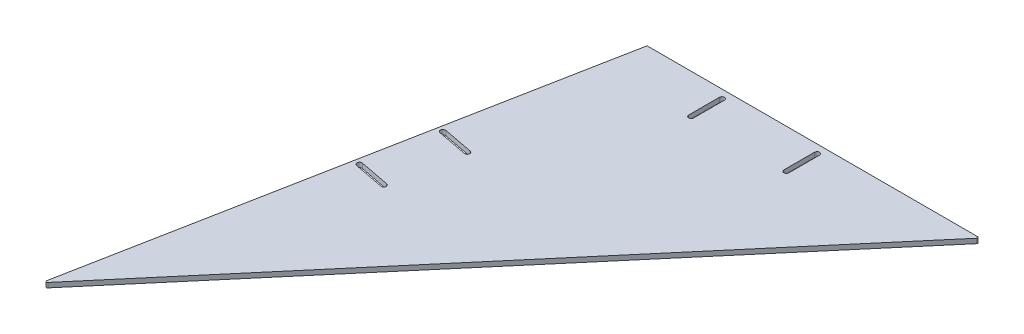
ISO-10303-21;
HEADER;
FILE_DESCRIPTION(('STEP AP214'),'2;1');
FILE_NAME('part.step','',(''),(''),'','','');
FILE_SCHEMA(('AUTOMOTIVE_DESIGN { 1 0 10303 214 1 1 1 1 }'));
ENDSEC;
DATA;
#1=APPLICATION_CONTEXT('core data for automotive mechanical design processes');
#2=APPLICATION_PROTOCOL_DEFINITION('international standard','automotive_design',2000,#1);
#3=PRODUCT_CONTEXT('',#1,'mechanical');
#4=PRODUCT('Part','Part','',(#3));
#5=PRODUCT_RELATED_PRODUCT_CATEGORY('part','',(#4));
#6=PRODUCT_DEFINITION_FORMATION('','',#4);
#7=PRODUCT_DEFINITION_CONTEXT('part definition',#1,'design');
#8=PRODUCT_DEFINITION('design','',#6,#7);
#9=PRODUCT_DEFINITION_SHAPE('','',#8);
#10=(LENGTH_UNIT() NAMED_UNIT(*) SI_UNIT(.MILLI.,.METRE.));
#11=(NAMED_UNIT(*) PLANE_ANGLE_UNIT() SI_UNIT($,.RADIAN.));
#12=(NAMED_UNIT(*) SI_UNIT($,.STERADIAN.) SOLID_ANGLE_UNIT());
#13=UNCERTAINTY_MEASURE_WITH_UNIT(LENGTH_MEASURE(1.E-05),#10,'distance_accuracy_value','');
#14=(GEOMETRIC_REPRESENTATION_CONTEXT(3) GLOBAL_UNCERTAINTY_ASSIGNED_CONTEXT((#13)) GLOBAL_UNIT_ASSIGNED_CONTEXT((#10,
#11,#12)) REPRESENTATION_CONTEXT('',''));
#15=CARTESIAN_POINT('',(0.,0.,0.));
#16=DIRECTION('',(0.,0.,1.));
#17=DIRECTION('',(1.,0.,0.));
#18=AXIS2_PLACEMENT_3D('',#15,#16,#17);
#19=CARTESIAN_POINT('',(0.,4.,0.));
#20=DIRECTION('',(0.,1.,0.));
#21=DIRECTION('',(0.,0.,1.));
#22=AXIS2_PLACEMENT_3D('',#19,#20,#21);
#23=PLANE('',#22);
#24=DIRECTION('',(-0.188731527093596,0.,0.982028721922592));
#25=VECTOR('',#24,1.);
#26=CARTESIAN_POINT('',(-280.,4.,0.));
#27=LINE('',#26,#25);
#28=CARTESIAN_POINT('',(-280.155913910007,4.,0.811268472906411));
#29=VERTEX_POINT('',#28);
#30=CARTESIAN_POINT('',(-361.378998507293,4.,423.440191080663));
#31=VERTEX_POINT('',#30);
#32=EDGE_CURVE('E329',#29,#31,#27,.T.);
#33=ORIENTED_EDGE('',*,*,#32,.T.);
#34=CARTESIAN_POINT('',(-360.396969785371,4.,423.628922607756));
#35=DIRECTION('',(0.,1.,0.));
#36=DIRECTION('',(0.,0.,1.));
#37=AXIS2_PLACEMENT_3D('',#34,#35,#36);
#38=CIRCLE('',#37,1.);
#39=CARTESIAN_POINT('',(-359.634143903163,4.,424.275526561838));
#40=VERTEX_POINT('',#39);
#41=EDGE_CURVE('E357',#31,#40,#38,.T.);
#42=ORIENTED_EDGE('',*,*,#41,.T.);
#43=DIRECTION('',(0.646603954081633,0.,-0.762825882207728));
#44=VECTOR('',#43,1.);
#45=CARTESIAN_POINT('',(-362.098214285714,4.,427.182494036328));
#46=LINE('',#45,#44);
#47=CARTESIAN_POINT('',(-1.39573217473193,4.,1.64660395408162));
#48=VERTEX_POINT('',#47);
#49=EDGE_CURVE('E324',#40,#48,#46,.T.);
#50=ORIENTED_EDGE('',*,*,#49,.T.);
#51=CARTESIAN_POINT('',(-2.15855805693969,4.,1.));
#52=DIRECTION('',(0.,1.,0.));
#53=DIRECTION('',(0.,0.,1.));
#54=AXIS2_PLACEMENT_3D('',#51,#52,#53);
#55=CIRCLE('',#54,1.);
#56=CARTESIAN_POINT('',(-2.15855805693969,4.,0.));
#57=VERTEX_POINT('',#56);
#58=EDGE_CURVE('E60',#48,#57,#55,.T.);
#59=ORIENTED_EDGE('',*,*,#58,.T.);
#60=DIRECTION('',(-1.,0.,0.));
#61=VECTOR('',#60,1.);
#62=CARTESIAN_POINT('',(0.,4.,0.));
#63=LINE('',#62,#61);
#64=CARTESIAN_POINT('',(-279.173885188085,4.,0.));
#65=VERTEX_POINT('',#64);
#66=EDGE_CURVE('E326',#57,#65,#63,.T.);
#67=ORIENTED_EDGE('',*,*,#66,.T.);
#68=CARTESIAN_POINT('',(-279.173885188085,4.,1.));
#69=DIRECTION('',(0.,1.,0.));
#70=DIRECTION('',(0.,0.,1.));
#71=AXIS2_PLACEMENT_3D('',#68,#69,#70);
#72=CIRCLE('',#71,1.);
#73=EDGE_CURVE('E354',#65,#29,#72,.T.);
#74=ORIENTED_EDGE('',*,*,#73,.T.);
#75=EDGE_LOOP('',(#33,#42,#50,#59,#67,#74));
#76=FACE_BOUND('',#75,.T.);
#77=DIRECTION('',(0.,0.,-1.));
#78=VECTOR('',#77,1.);
#79=CARTESIAN_POINT('',(-207.9,4.,32.9));
#80=LINE('',#79,#78);
#81=CARTESIAN_POINT('',(-207.9,4.,32.9));
#82=VERTEX_POINT('',#81);
#83=CARTESIAN_POINT('',(-207.9,4.,7.09999999999999));
#84=VERTEX_POINT('',#83);
#85=EDGE_CURVE('E295',#82,#84,#80,.T.);
#86=ORIENTED_EDGE('',*,*,#85,.F.);
#87=CARTESIAN_POINT('',(-210.,4.,32.9));
#88=DIRECTION('',(0.,1.,0.));
#89=DIRECTION('',(0.,0.,-1.));
#90=AXIS2_PLACEMENT_3D('',#87,#88,#89);
#91=CIRCLE('',#90,2.09999999999999);
#92=CARTESIAN_POINT('',(-212.1,4.,32.9));
#93=VERTEX_POINT('',#92);
#94=EDGE_CURVE('E293',#93,#82,#91,.T.);
#95=ORIENTED_EDGE('',*,*,#94,.F.);
#96=DIRECTION('',(0.,0.,1.));
#97=VECTOR('',#96,1.);
#98=CARTESIAN_POINT('',(-212.1,4.,32.9));
#99=LINE('',#98,#97);
#100=CARTESIAN_POINT('',(-212.1,4.,7.09999999999999));
#101=VERTEX_POINT('',#100);
#102=EDGE_CURVE('E301',#101,#93,#99,.T.);
#103=ORIENTED_EDGE('',*,*,#102,.F.);
#104=CARTESIAN_POINT('',(-210.,4.,7.09999999999999));
#105=DIRECTION('',(0.,1.,0.));
#106=DIRECTION('',(0.,0.,-1.));
#107=AXIS2_PLACEMENT_3D('',#104,#105,#106);
#108=CIRCLE('',#107,2.09999999999996);
#109=EDGE_CURVE('E298',#84,#101,#108,.T.);
#110=ORIENTED_EDGE('',*,*,#109,.F.);
#111=EDGE_LOOP('',(#86,#95,#103,#110));
#112=FACE_BOUND('',#111,.T.);
#113=DIRECTION('',(0.,0.,-1.));
#114=VECTOR('',#113,1.);
#115=CARTESIAN_POINT('',(-127.9,4.,32.9));
#116=LINE('',#115,#114);
#117=CARTESIAN_POINT('',(-127.9,4.,32.9));
#118=VERTEX_POINT('',#117);
#119=CARTESIAN_POINT('',(-127.9,4.,7.10000000000001));
#120=VERTEX_POINT('',#119);
#121=EDGE_CURVE('E264',#118,#120,#116,.T.);
#122=ORIENTED_EDGE('',*,*,#121,.F.);
#123=CARTESIAN_POINT('',(-130.,4.,32.9));
#124=DIRECTION('',(0.,1.,0.));
#125=DIRECTION('',(0.,0.,1.));
#126=AXIS2_PLACEMENT_3D('',#123,#124,#125);
#127=CIRCLE('',#126,2.10000000000002);
#128=CARTESIAN_POINT('',(-132.1,4.,32.9));
#129=VERTEX_POINT('',#128);
#130=EDGE_CURVE('E262',#129,#118,#127,.T.);
#131=ORIENTED_EDGE('',*,*,#130,.F.);
#132=DIRECTION('',(0.,0.,1.));
#133=VECTOR('',#132,1.);
#134=CARTESIAN_POINT('',(-132.1,4.,32.9));
#135=LINE('',#134,#133);
#136=CARTESIAN_POINT('',(-132.1,4.,7.10000000000001));
#137=VERTEX_POINT('',#136);
#138=EDGE_CURVE('E270',#137,#129,#135,.T.);
#139=ORIENTED_EDGE('',*,*,#138,.F.);
#140=CARTESIAN_POINT('',(-130.,4.,7.10000000000001));
#141=DIRECTION('',(0.,1.,0.));
#142=DIRECTION('',(0.,0.,1.));
#143=AXIS2_PLACEMENT_3D('',#140,#141,#142);
#144=CIRCLE('',#143,2.09999999999999);
#145=EDGE_CURVE('E267',#120,#137,#144,.T.);
#146=ORIENTED_EDGE('',*,*,#145,.F.);
#147=EDGE_LOOP('',(#122,#131,#139,#146));
#148=FACE_BOUND('',#147,.T.);
#149=DIRECTION('',(-0.982028721922592,0.,-0.188731527093597));
#150=VECTOR('',#149,1.);
#151=CARTESIAN_POINT('',(-277.666908221927,4.,151.054979006834));
#152=LINE('',#151,#150);
#153=CARTESIAN_POINT('',(-277.666908221927,4.,151.054979006834));
#154=VERTEX_POINT('',#153);
#155=CARTESIAN_POINT('',(-303.00324924753,4.,146.185705607819));
#156=VERTEX_POINT('',#155);
#157=EDGE_CURVE('E233',#154,#156,#152,.T.);
#158=ORIENTED_EDGE('',*,*,#157,.F.);
#159=CARTESIAN_POINT('',(-278.063244428824,4.,153.117239322871));
#160=DIRECTION('',(0.,1.,0.));
#161=DIRECTION('',(0.,0.,-1.));
#162=AXIS2_PLACEMENT_3D('',#159,#160,#161);
#163=CIRCLE('',#162,2.09999999999995);
#164=CARTESIAN_POINT('',(-278.45958063572,4.,155.179499638909));
#165=VERTEX_POINT('',#164);
#166=EDGE_CURVE('E231',#165,#154,#163,.T.);
#167=ORIENTED_EDGE('',*,*,#166,.F.);
#168=DIRECTION('',(0.982028721922592,0.,0.188731527093594));
#169=VECTOR('',#168,1.);
#170=CARTESIAN_POINT('',(-278.45958063572,4.,155.179499638909));
#171=LINE('',#170,#169);
#172=CARTESIAN_POINT('',(-303.795921661323,4.,150.310226239894));
#173=VERTEX_POINT('',#172);
#174=EDGE_CURVE('E239',#173,#165,#171,.T.);
#175=ORIENTED_EDGE('',*,*,#174,.F.);
#176=CARTESIAN_POINT('',(-303.399585454427,4.,148.247965923857));
#177=DIRECTION('',(0.,1.,0.));
#178=DIRECTION('',(0.,0.,-1.));
#179=AXIS2_PLACEMENT_3D('',#176,#177,#178);
#180=CIRCLE('',#179,2.1);
#181=EDGE_CURVE('E236',#156,#173,#180,.T.);
#182=ORIENTED_EDGE('',*,*,#181,.F.);
#183=EDGE_LOOP('',(#158,#167,#175,#182));
#184=FACE_BOUND('',#183,.T.);
#185=DIRECTION('',(-0.982028721922591,0.,-0.188731527093598));
#186=VECTOR('',#185,1.);
#187=CARTESIAN_POINT('',(-288.990799847543,4.,209.97670232219));
#188=LINE('',#187,#186);
#189=CARTESIAN_POINT('',(-288.990799847543,4.,209.97670232219));
#190=VERTEX_POINT('',#189);
#191=CARTESIAN_POINT('',(-314.327140873146,4.,205.107428923175));
#192=VERTEX_POINT('',#191);
#193=EDGE_CURVE('E200',#190,#192,#188,.T.);
#194=ORIENTED_EDGE('',*,*,#193,.F.);
#195=CARTESIAN_POINT('',(-289.387136054439,4.,212.038962638227));
#196=DIRECTION('',(0.,1.,0.));
#197=DIRECTION('',(0.,0.,1.));
#198=AXIS2_PLACEMENT_3D('',#195,#196,#197);
#199=CIRCLE('',#198,2.09999999999995);
#200=CARTESIAN_POINT('',(-289.783472261336,4.,214.101222954264));
#201=VERTEX_POINT('',#200);
#202=EDGE_CURVE('E190',#201,#190,#199,.T.);
#203=ORIENTED_EDGE('',*,*,#202,.F.);
#204=DIRECTION('',(0.982028721922592,0.,0.188731527093594));
#205=VECTOR('',#204,1.);
#206=CARTESIAN_POINT('',(-289.783472261336,4.,214.101222954264));
#207=LINE('',#206,#205);
#208=CARTESIAN_POINT('',(-315.119813286939,4.,209.23194955525));
#209=VERTEX_POINT('',#208);
#210=EDGE_CURVE('E215',#209,#201,#207,.T.);
#211=ORIENTED_EDGE('',*,*,#210,.F.);
#212=CARTESIAN_POINT('',(-314.723477080042,4.,207.169689239212));
#213=DIRECTION('',(0.,1.,0.));
#214=DIRECTION('',(0.,0.,1.));
#215=AXIS2_PLACEMENT_3D('',#212,#213,#214);
#216=CIRCLE('',#215,2.1);
#217=EDGE_CURVE('E213',#192,#209,#216,.T.);
#218=ORIENTED_EDGE('',*,*,#217,.F.);
#219=EDGE_LOOP('',(#194,#203,#211,#218));
#220=FACE_BOUND('',#219,.T.);
#221=ADVANCED_FACE('F39',(#76,#112,#148,#184,#220),#23,.T.);
#222=CARTESIAN_POINT('',(0.,0.,0.));
#223=DIRECTION('',(0.,1.,0.));
#224=DIRECTION('',(0.,0.,1.));
#225=AXIS2_PLACEMENT_3D('',#222,#223,#224);
#226=PLANE('',#225);
#227=CARTESIAN_POINT('',(-278.063244428824,0.,153.117239322871));
#228=DIRECTION('',(0.,1.,0.));
#229=DIRECTION('',(0.,0.,-1.));
#230=AXIS2_PLACEMENT_3D('',#227,#228,#229);
#231=CIRCLE('',#230,2.09999999999995);
#232=CARTESIAN_POINT('',(-278.45958063572,0.,155.179499638909));
#233=VERTEX_POINT('',#232);
#234=CARTESIAN_POINT('',(-277.666908221927,0.,151.054979006834));
#235=VERTEX_POINT('',#234);
#236=EDGE_CURVE('E208',#233,#235,#231,.T.);
#237=ORIENTED_EDGE('',*,*,#236,.T.);
#238=DIRECTION('',(-0.982028721922592,0.,-0.188731527093597));
#239=VECTOR('',#238,1.);
#240=CARTESIAN_POINT('',(-277.666908221927,0.,151.054979006834));
#241=LINE('',#240,#239);
#242=CARTESIAN_POINT('',(-303.00324924753,0.,146.185705607819));
#243=VERTEX_POINT('',#242);
#244=EDGE_CURVE('E244',#235,#243,#241,.T.);
#245=ORIENTED_EDGE('',*,*,#244,.T.);
#246=CARTESIAN_POINT('',(-303.399585454427,0.,148.247965923857));
#247=DIRECTION('',(0.,1.,0.));
#248=DIRECTION('',(0.,0.,-1.));
#249=AXIS2_PLACEMENT_3D('',#246,#247,#248);
#250=CIRCLE('',#249,2.1);
#251=CARTESIAN_POINT('',(-303.795921661323,0.,150.310226239894));
#252=VERTEX_POINT('',#251);
#253=EDGE_CURVE('E247',#243,#252,#250,.T.);
#254=ORIENTED_EDGE('',*,*,#253,.T.);
#255=DIRECTION('',(0.982028721922592,0.,0.188731527093594));
#256=VECTOR('',#255,1.);
#257=CARTESIAN_POINT('',(-278.45958063572,0.,155.179499638909));
#258=LINE('',#257,#256);
#259=EDGE_CURVE('E234',#252,#233,#258,.T.);
#260=ORIENTED_EDGE('',*,*,#259,.T.);
#261=EDGE_LOOP('',(#237,#245,#254,#260));
#262=FACE_BOUND('',#261,.T.);
#263=CARTESIAN_POINT('',(-210.,0.,32.9));
#264=DIRECTION('',(0.,1.,0.));
#265=DIRECTION('',(0.,0.,-1.));
#266=AXIS2_PLACEMENT_3D('',#263,#264,#265);
#267=CIRCLE('',#266,2.09999999999999);
#268=CARTESIAN_POINT('',(-212.1,0.,32.9));
#269=VERTEX_POINT('',#268);
#270=CARTESIAN_POINT('',(-207.9,0.,32.9));
#271=VERTEX_POINT('',#270);
#272=EDGE_CURVE('E292',#269,#271,#267,.T.);
#273=ORIENTED_EDGE('',*,*,#272,.T.);
#274=DIRECTION('',(0.,0.,-1.));
#275=VECTOR('',#274,1.);
#276=CARTESIAN_POINT('',(-207.9,0.,32.9));
#277=LINE('',#276,#275);
#278=CARTESIAN_POINT('',(-207.9,0.,7.09999999999999));
#279=VERTEX_POINT('',#278);
#280=EDGE_CURVE('E306',#271,#279,#277,.T.);
#281=ORIENTED_EDGE('',*,*,#280,.T.);
#282=CARTESIAN_POINT('',(-210.,0.,7.09999999999999));
#283=DIRECTION('',(0.,1.,0.));
#284=DIRECTION('',(0.,0.,-1.));
#285=AXIS2_PLACEMENT_3D('',#282,#283,#284);
#286=CIRCLE('',#285,2.09999999999996);
#287=CARTESIAN_POINT('',(-212.1,0.,7.09999999999999));
#288=VERTEX_POINT('',#287);
#289=EDGE_CURVE('E309',#279,#288,#286,.T.);
#290=ORIENTED_EDGE('',*,*,#289,.T.);
#291=DIRECTION('',(0.,0.,1.));
#292=VECTOR('',#291,1.);
#293=CARTESIAN_POINT('',(-212.1,0.,32.9));
#294=LINE('',#293,#292);
#295=EDGE_CURVE('E296',#288,#269,#294,.T.);
#296=ORIENTED_EDGE('',*,*,#295,.T.);
#297=EDGE_LOOP('',(#273,#281,#290,#296));
#298=FACE_BOUND('',#297,.T.);
#299=DIRECTION('',(0.646603954081633,0.,-0.762825882207728));
#300=VECTOR('',#299,1.);
#301=CARTESIAN_POINT('',(-362.098214285714,0.,427.182494036328));
#302=LINE('',#301,#300);
#303=CARTESIAN_POINT('',(-359.634143903163,0.,424.275526561838));
#304=VERTEX_POINT('',#303);
#305=CARTESIAN_POINT('',(-1.39573217473193,0.,1.64660395408162));
#306=VERTEX_POINT('',#305);
#307=EDGE_CURVE('E323',#304,#306,#302,.T.);
#308=ORIENTED_EDGE('',*,*,#307,.F.);
#309=CARTESIAN_POINT('',(-360.396969785371,0.,423.628922607756));
#310=DIRECTION('',(0.,1.,0.));
#311=DIRECTION('',(0.,0.,1.));
#312=AXIS2_PLACEMENT_3D('',#309,#310,#311);
#313=CIRCLE('',#312,1.);
#314=CARTESIAN_POINT('',(-361.378998507293,0.,423.440191080663));
#315=VERTEX_POINT('',#314);
#316=EDGE_CURVE('E347',#304,#315,#313,.F.);
#317=ORIENTED_EDGE('',*,*,#316,.T.);
#318=DIRECTION('',(-0.188731527093596,0.,0.982028721922592));
#319=VECTOR('',#318,1.);
#320=CARTESIAN_POINT('',(-280.,0.,0.));
#321=LINE('',#320,#319);
#322=CARTESIAN_POINT('',(-280.155913910007,0.,0.811268472906411));
#323=VERTEX_POINT('',#322);
#324=EDGE_CURVE('E327',#323,#315,#321,.T.);
#325=ORIENTED_EDGE('',*,*,#324,.F.);
#326=CARTESIAN_POINT('',(-279.173885188085,0.,1.));
#327=DIRECTION('',(0.,1.,0.));
#328=DIRECTION('',(0.,0.,1.));
#329=AXIS2_PLACEMENT_3D('',#326,#327,#328);
#330=CIRCLE('',#329,1.);
#331=CARTESIAN_POINT('',(-279.173885188085,0.,0.));
#332=VERTEX_POINT('',#331);
#333=EDGE_CURVE('E343',#323,#332,#330,.F.);
#334=ORIENTED_EDGE('',*,*,#333,.T.);
#335=DIRECTION('',(-1.,0.,0.));
#336=VECTOR('',#335,1.);
#337=CARTESIAN_POINT('',(0.,0.,0.));
#338=LINE('',#337,#336);
#339=CARTESIAN_POINT('',(-2.15855805693969,0.,0.));
#340=VERTEX_POINT('',#339);
#341=EDGE_CURVE('E335',#340,#332,#338,.T.);
#342=ORIENTED_EDGE('',*,*,#341,.F.);
#343=CARTESIAN_POINT('',(-2.15855805693969,0.,1.));
#344=DIRECTION('',(0.,1.,0.));
#345=DIRECTION('',(0.,0.,1.));
#346=AXIS2_PLACEMENT_3D('',#343,#344,#345);
#347=CIRCLE('',#346,1.);
#348=EDGE_CURVE('E345',#340,#306,#347,.F.);
#349=ORIENTED_EDGE('',*,*,#348,.T.);
#350=EDGE_LOOP('',(#308,#317,#325,#334,#342,#349));
#351=FACE_BOUND('',#350,.T.);
#352=CARTESIAN_POINT('',(-130.,0.,32.9));
#353=DIRECTION('',(0.,1.,0.));
#354=DIRECTION('',(0.,0.,1.));
#355=AXIS2_PLACEMENT_3D('',#352,#353,#354);
#356=CIRCLE('',#355,2.10000000000002);
#357=CARTESIAN_POINT('',(-132.1,0.,32.9));
#358=VERTEX_POINT('',#357);
#359=CARTESIAN_POINT('',(-127.9,0.,32.9));
#360=VERTEX_POINT('',#359);
#361=EDGE_CURVE('E261',#358,#360,#356,.T.);
#362=ORIENTED_EDGE('',*,*,#361,.T.);
#363=DIRECTION('',(0.,0.,-1.));
#364=VECTOR('',#363,1.);
#365=CARTESIAN_POINT('',(-127.9,0.,32.9));
#366=LINE('',#365,#364);
#367=CARTESIAN_POINT('',(-127.9,0.,7.10000000000001));
#368=VERTEX_POINT('',#367);
#369=EDGE_CURVE('E275',#360,#368,#366,.T.);
#370=ORIENTED_EDGE('',*,*,#369,.T.);
#371=CARTESIAN_POINT('',(-130.,0.,7.10000000000001));
#372=DIRECTION('',(0.,1.,0.));
#373=DIRECTION('',(0.,0.,1.));
#374=AXIS2_PLACEMENT_3D('',#371,#372,#373);
#375=CIRCLE('',#374,2.09999999999999);
#376=CARTESIAN_POINT('',(-132.1,0.,7.10000000000001));
#377=VERTEX_POINT('',#376);
#378=EDGE_CURVE('E278',#368,#377,#375,.T.);
#379=ORIENTED_EDGE('',*,*,#378,.T.);
#380=DIRECTION('',(0.,0.,1.));
#381=VECTOR('',#380,1.);
#382=CARTESIAN_POINT('',(-132.1,0.,32.9));
#383=LINE('',#382,#381);
#384=EDGE_CURVE('E265',#377,#358,#383,.T.);
#385=ORIENTED_EDGE('',*,*,#384,.T.);
#386=EDGE_LOOP('',(#362,#370,#379,#385));
#387=FACE_BOUND('',#386,.T.);
#388=CARTESIAN_POINT('',(-289.387136054439,0.,212.038962638227));
#389=DIRECTION('',(0.,1.,0.));
#390=DIRECTION('',(0.,0.,1.));
#391=AXIS2_PLACEMENT_3D('',#388,#389,#390);
#392=CIRCLE('',#391,2.09999999999995);
#393=CARTESIAN_POINT('',(-289.783472261336,0.,214.101222954264));
#394=VERTEX_POINT('',#393);
#395=CARTESIAN_POINT('',(-288.990799847543,0.,209.97670232219));
#396=VERTEX_POINT('',#395);
#397=EDGE_CURVE('E219',#394,#396,#392,.T.);
#398=ORIENTED_EDGE('',*,*,#397,.T.);
#399=DIRECTION('',(-0.982028721922591,0.,-0.188731527093598));
#400=VECTOR('',#399,1.);
#401=CARTESIAN_POINT('',(-288.990799847543,0.,209.97670232219));
#402=LINE('',#401,#400);
#403=CARTESIAN_POINT('',(-314.327140873146,0.,205.107428923175));
#404=VERTEX_POINT('',#403);
#405=EDGE_CURVE('E207',#396,#404,#402,.T.);
#406=ORIENTED_EDGE('',*,*,#405,.T.);
#407=CARTESIAN_POINT('',(-314.723477080042,0.,207.169689239212));
#408=DIRECTION('',(0.,1.,0.));
#409=DIRECTION('',(0.,0.,1.));
#410=AXIS2_PLACEMENT_3D('',#407,#408,#409);
#411=CIRCLE('',#410,2.1);
#412=CARTESIAN_POINT('',(-315.119813286939,0.,209.23194955525));
#413=VERTEX_POINT('',#412);
#414=EDGE_CURVE('E222',#404,#413,#411,.T.);
#415=ORIENTED_EDGE('',*,*,#414,.T.);
#416=DIRECTION('',(0.982028721922592,0.,0.188731527093594));
#417=VECTOR('',#416,1.);
#418=CARTESIAN_POINT('',(-289.783472261336,0.,214.101222954264));
#419=LINE('',#418,#417);
#420=EDGE_CURVE('E201',#413,#394,#419,.T.);
#421=ORIENTED_EDGE('',*,*,#420,.T.);
#422=EDGE_LOOP('',(#398,#406,#415,#421));
#423=FACE_BOUND('',#422,.T.);
#424=ADVANCED_FACE('F372',(#262,#298,#351,#387,#423),#226,.F.);
#425=CARTESIAN_POINT('',(-362.098214285714,4.,427.182494036328));
#426=DIRECTION('',(-0.762825882207728,0.,-0.646603954081633));
#427=DIRECTION('',(-0.646603954081633,0.,0.762825882207728));
#428=AXIS2_PLACEMENT_3D('',#425,#426,#427);
#429=PLANE('',#428);
#430=ORIENTED_EDGE('',*,*,#49,.F.);
#431=DIRECTION('',(0.,-1.,0.));
#432=VECTOR('',#431,1.);
#433=CARTESIAN_POINT('',(-359.634143903163,4.,424.275526561838));
#434=LINE('',#433,#432);
#435=EDGE_CURVE('E340',#40,#304,#434,.T.);
#436=ORIENTED_EDGE('',*,*,#435,.T.);
#437=ORIENTED_EDGE('',*,*,#307,.T.);
#438=DIRECTION('',(0.,-1.,0.));
#439=VECTOR('',#438,1.);
#440=CARTESIAN_POINT('',(-1.39573217473188,4.,1.6466039540815));
#441=LINE('',#440,#439);
#442=EDGE_CURVE('E332',#306,#48,#441,.F.);
#443=ORIENTED_EDGE('',*,*,#442,.T.);
#444=EDGE_LOOP('',(#430,#436,#437,#443));
#445=FACE_BOUND('',#444,.T.);
#446=ADVANCED_FACE('F366',(#445),#429,.F.);
#447=CARTESIAN_POINT('',(0.,4.,0.));
#448=DIRECTION('',(0.,0.,1.));
#449=DIRECTION('',(1.,0.,0.));
#450=AXIS2_PLACEMENT_3D('',#447,#448,#449);
#451=PLANE('',#450);
#452=ORIENTED_EDGE('',*,*,#66,.F.);
#453=DIRECTION('',(0.,-1.,0.));
#454=VECTOR('',#453,1.);
#455=CARTESIAN_POINT('',(-2.15855805693969,4.,0.));
#456=LINE('',#455,#454);
#457=EDGE_CURVE('E11',#57,#340,#456,.T.);
#458=ORIENTED_EDGE('',*,*,#457,.T.);
#459=ORIENTED_EDGE('',*,*,#341,.T.);
#460=DIRECTION('',(0.,-1.,0.));
#461=VECTOR('',#460,1.);
#462=CARTESIAN_POINT('',(-279.173885188085,4.,0.));
#463=LINE('',#462,#461);
#464=EDGE_CURVE('E47',#332,#65,#463,.F.);
#465=ORIENTED_EDGE('',*,*,#464,.T.);
#466=EDGE_LOOP('',(#452,#458,#459,#465));
#467=FACE_BOUND('',#466,.T.);
#468=ADVANCED_FACE('F380',(#467),#451,.F.);
#469=CARTESIAN_POINT('',(-280.,4.,0.));
#470=DIRECTION('',(0.982028721922592,0.,0.188731527093596));
#471=DIRECTION('',(0.188731527093596,0.,-0.982028721922592));
#472=AXIS2_PLACEMENT_3D('',#469,#470,#471);
#473=PLANE('',#472);
#474=ORIENTED_EDGE('',*,*,#324,.T.);
#475=DIRECTION('',(0.,-1.,0.));
#476=VECTOR('',#475,1.);
#477=CARTESIAN_POINT('',(-361.378998507293,4.,423.440191080663));
#478=LINE('',#477,#476);
#479=EDGE_CURVE('E352',#315,#31,#478,.F.);
#480=ORIENTED_EDGE('',*,*,#479,.T.);
#481=ORIENTED_EDGE('',*,*,#32,.F.);
#482=DIRECTION('',(0.,-1.,0.));
#483=VECTOR('',#482,1.);
#484=CARTESIAN_POINT('',(-280.155913910007,4.,0.811268472906408));
#485=LINE('',#484,#483);
#486=EDGE_CURVE('E349',#29,#323,#485,.T.);
#487=ORIENTED_EDGE('',*,*,#486,.T.);
#488=EDGE_LOOP('',(#474,#480,#481,#487));
#489=FACE_BOUND('',#488,.T.);
#490=ADVANCED_FACE('F375',(#489),#473,.F.);
#491=CARTESIAN_POINT('',(-210.,4.,32.9));
#492=DIRECTION('',(0.,-1.,0.));
#493=DIRECTION('',(0.,0.,-1.));
#494=AXIS2_PLACEMENT_3D('',#491,#492,#493);
#495=CYLINDRICAL_SURFACE('',#494,2.09999999999999);
#496=ORIENTED_EDGE('',*,*,#272,.F.);
#497=DIRECTION('',(0.,-1.,0.));
#498=VECTOR('',#497,1.);
#499=CARTESIAN_POINT('',(-212.1,4.,32.9));
#500=LINE('',#499,#498);
#501=EDGE_CURVE('E303',#93,#269,#500,.T.);
#502=ORIENTED_EDGE('',*,*,#501,.F.);
#503=ORIENTED_EDGE('',*,*,#94,.T.);
#504=DIRECTION('',(0.,-1.,0.));
#505=VECTOR('',#504,1.);
#506=CARTESIAN_POINT('',(-207.9,4.,32.9));
#507=LINE('',#506,#505);
#508=EDGE_CURVE('E320',#82,#271,#507,.T.);
#509=ORIENTED_EDGE('',*,*,#508,.T.);
#510=EDGE_LOOP('',(#496,#502,#503,#509));
#511=FACE_BOUND('',#510,.T.);
#512=ADVANCED_FACE('F400',(#511),#495,.F.);
#513=CARTESIAN_POINT('',(-207.9,4.,32.9));
#514=DIRECTION('',(-1.,0.,0.));
#515=DIRECTION('',(0.,0.,1.));
#516=AXIS2_PLACEMENT_3D('',#513,#514,#515);
#517=PLANE('',#516);
#518=ORIENTED_EDGE('',*,*,#280,.F.);
#519=ORIENTED_EDGE('',*,*,#508,.F.);
#520=ORIENTED_EDGE('',*,*,#85,.T.);
#521=DIRECTION('',(0.,-1.,0.));
#522=VECTOR('',#521,1.);
#523=CARTESIAN_POINT('',(-207.9,4.,7.09999999999999));
#524=LINE('',#523,#522);
#525=EDGE_CURVE('E318',#84,#279,#524,.T.);
#526=ORIENTED_EDGE('',*,*,#525,.T.);
#527=EDGE_LOOP('',(#518,#519,#520,#526));
#528=FACE_BOUND('',#527,.T.);
#529=ADVANCED_FACE('F573',(#528),#517,.T.);
#530=CARTESIAN_POINT('',(-210.,4.,7.09999999999999));
#531=DIRECTION('',(0.,-1.,0.));
#532=DIRECTION('',(0.,0.,-1.));
#533=AXIS2_PLACEMENT_3D('',#530,#531,#532);
#534=CYLINDRICAL_SURFACE('',#533,2.09999999999996);
#535=ORIENTED_EDGE('',*,*,#289,.F.);
#536=ORIENTED_EDGE('',*,*,#525,.F.);
#537=ORIENTED_EDGE('',*,*,#109,.T.);
#538=DIRECTION('',(0.,-1.,0.));
#539=VECTOR('',#538,1.);
#540=CARTESIAN_POINT('',(-212.1,4.,7.09999999999999));
#541=LINE('',#540,#539);
#542=EDGE_CURVE('E316',#101,#288,#541,.T.);
#543=ORIENTED_EDGE('',*,*,#542,.T.);
#544=EDGE_LOOP('',(#535,#536,#537,#543));
#545=FACE_BOUND('',#544,.T.);
#546=ADVANCED_FACE('F563',(#545),#534,.F.);
#547=CARTESIAN_POINT('',(-212.1,4.,32.9));
#548=DIRECTION('',(1.,0.,0.));
#549=DIRECTION('',(0.,0.,-1.));
#550=AXIS2_PLACEMENT_3D('',#547,#548,#549);
#551=PLANE('',#550);
#552=ORIENTED_EDGE('',*,*,#295,.F.);
#553=ORIENTED_EDGE('',*,*,#542,.F.);
#554=ORIENTED_EDGE('',*,*,#102,.T.);
#555=ORIENTED_EDGE('',*,*,#501,.T.);
#556=EDGE_LOOP('',(#552,#553,#554,#555));
#557=FACE_BOUND('',#556,.T.);
#558=ADVANCED_FACE('F553',(#557),#551,.T.);
#559=CARTESIAN_POINT('',(-130.,4.,32.9));
#560=DIRECTION('',(0.,-1.,0.));
#561=DIRECTION('',(0.,0.,-1.));
#562=AXIS2_PLACEMENT_3D('',#559,#560,#561);
#563=CYLINDRICAL_SURFACE('',#562,2.10000000000002);
#564=ORIENTED_EDGE('',*,*,#361,.F.);
#565=DIRECTION('',(0.,-1.,0.));
#566=VECTOR('',#565,1.);
#567=CARTESIAN_POINT('',(-132.1,4.,32.9));
#568=LINE('',#567,#566);
#569=EDGE_CURVE('E272',#129,#358,#568,.T.);
#570=ORIENTED_EDGE('',*,*,#569,.F.);
#571=ORIENTED_EDGE('',*,*,#130,.T.);
#572=DIRECTION('',(0.,-1.,0.));
#573=VECTOR('',#572,1.);
#574=CARTESIAN_POINT('',(-127.9,4.,32.9));
#575=LINE('',#574,#573);
#576=EDGE_CURVE('E289',#118,#360,#575,.T.);
#577=ORIENTED_EDGE('',*,*,#576,.T.);
#578=EDGE_LOOP('',(#564,#570,#571,#577));
#579=FACE_BOUND('',#578,.T.);
#580=ADVANCED_FACE('F543',(#579),#563,.F.);
#581=CARTESIAN_POINT('',(-127.9,4.,32.9));
#582=DIRECTION('',(-1.,0.,0.));
#583=DIRECTION('',(0.,0.,1.));
#584=AXIS2_PLACEMENT_3D('',#581,#582,#583);
#585=PLANE('',#584);
#586=ORIENTED_EDGE('',*,*,#369,.F.);
#587=ORIENTED_EDGE('',*,*,#576,.F.);
#588=ORIENTED_EDGE('',*,*,#121,.T.);
#589=DIRECTION('',(0.,-1.,0.));
#590=VECTOR('',#589,1.);
#591=CARTESIAN_POINT('',(-127.9,4.,7.10000000000001));
#592=LINE('',#591,#590);
#593=EDGE_CURVE('E287',#120,#368,#592,.T.);
#594=ORIENTED_EDGE('',*,*,#593,.T.);
#595=EDGE_LOOP('',(#586,#587,#588,#594));
#596=FACE_BOUND('',#595,.T.);
#597=ADVANCED_FACE('F533',(#596),#585,.T.);
#598=CARTESIAN_POINT('',(-130.,4.,7.10000000000001));
#599=DIRECTION('',(0.,-1.,0.));
#600=DIRECTION('',(0.,0.,-1.));
#601=AXIS2_PLACEMENT_3D('',#598,#599,#600);
#602=CYLINDRICAL_SURFACE('',#601,2.09999999999999);
#603=ORIENTED_EDGE('',*,*,#378,.F.);
#604=ORIENTED_EDGE('',*,*,#593,.F.);
#605=ORIENTED_EDGE('',*,*,#145,.T.);
#606=DIRECTION('',(0.,-1.,0.));
#607=VECTOR('',#606,1.);
#608=CARTESIAN_POINT('',(-132.1,4.,7.10000000000001));
#609=LINE('',#608,#607);
#610=EDGE_CURVE('E285',#137,#377,#609,.T.);
#611=ORIENTED_EDGE('',*,*,#610,.T.);
#612=EDGE_LOOP('',(#603,#604,#605,#611));
#613=FACE_BOUND('',#612,.T.);
#614=ADVANCED_FACE('F523',(#613),#602,.F.);
#615=CARTESIAN_POINT('',(-132.1,4.,32.9));
#616=DIRECTION('',(1.,0.,0.));
#617=DIRECTION('',(0.,0.,-1.));
#618=AXIS2_PLACEMENT_3D('',#615,#616,#617);
#619=PLANE('',#618);
#620=ORIENTED_EDGE('',*,*,#384,.F.);
#621=ORIENTED_EDGE('',*,*,#610,.F.);
#622=ORIENTED_EDGE('',*,*,#138,.T.);
#623=ORIENTED_EDGE('',*,*,#569,.T.);
#624=EDGE_LOOP('',(#620,#621,#622,#623));
#625=FACE_BOUND('',#624,.T.);
#626=ADVANCED_FACE('F513',(#625),#619,.T.);
#627=CARTESIAN_POINT('',(-278.063244428824,4.,153.117239322871));
#628=DIRECTION('',(0.,-1.,0.));
#629=DIRECTION('',(0.,0.,-1.));
#630=AXIS2_PLACEMENT_3D('',#627,#628,#629);
#631=CYLINDRICAL_SURFACE('',#630,2.09999999999995);
#632=ORIENTED_EDGE('',*,*,#236,.F.);
#633=DIRECTION('',(0.,-1.,0.));
#634=VECTOR('',#633,1.);
#635=CARTESIAN_POINT('',(-278.45958063572,4.,155.179499638909));
#636=LINE('',#635,#634);
#637=EDGE_CURVE('E241',#165,#233,#636,.T.);
#638=ORIENTED_EDGE('',*,*,#637,.F.);
#639=ORIENTED_EDGE('',*,*,#166,.T.);
#640=DIRECTION('',(0.,-1.,0.));
#641=VECTOR('',#640,1.);
#642=CARTESIAN_POINT('',(-277.666908221927,4.,151.054979006834));
#643=LINE('',#642,#641);
#644=EDGE_CURVE('E258',#154,#235,#643,.T.);
#645=ORIENTED_EDGE('',*,*,#644,.T.);
#646=EDGE_LOOP('',(#632,#638,#639,#645));
#647=FACE_BOUND('',#646,.T.);
#648=ADVANCED_FACE('F503',(#647),#631,.F.);
#649=CARTESIAN_POINT('',(-277.666908221927,4.,151.054979006834));
#650=DIRECTION('',(-0.188731527093597,0.,0.982028721922592));
#651=DIRECTION('',(0.982028721922592,0.,0.188731527093597));
#652=AXIS2_PLACEMENT_3D('',#649,#650,#651);
#653=PLANE('',#652);
#654=ORIENTED_EDGE('',*,*,#244,.F.);
#655=ORIENTED_EDGE('',*,*,#644,.F.);
#656=ORIENTED_EDGE('',*,*,#157,.T.);
#657=DIRECTION('',(0.,-1.,0.));
#658=VECTOR('',#657,1.);
#659=CARTESIAN_POINT('',(-303.00324924753,4.,146.185705607819));
#660=LINE('',#659,#658);
#661=EDGE_CURVE('E256',#156,#243,#660,.T.);
#662=ORIENTED_EDGE('',*,*,#661,.T.);
#663=EDGE_LOOP('',(#654,#655,#656,#662));
#664=FACE_BOUND('',#663,.T.);
#665=ADVANCED_FACE('F493',(#664),#653,.T.);
#666=CARTESIAN_POINT('',(-303.399585454427,4.,148.247965923857));
#667=DIRECTION('',(0.,-1.,0.));
#668=DIRECTION('',(0.,0.,-1.));
#669=AXIS2_PLACEMENT_3D('',#666,#667,#668);
#670=CYLINDRICAL_SURFACE('',#669,2.1);
#671=ORIENTED_EDGE('',*,*,#253,.F.);
#672=ORIENTED_EDGE('',*,*,#661,.F.);
#673=ORIENTED_EDGE('',*,*,#181,.T.);
#674=DIRECTION('',(0.,-1.,0.));
#675=VECTOR('',#674,1.);
#676=CARTESIAN_POINT('',(-303.795921661323,4.,150.310226239894));
#677=LINE('',#676,#675);
#678=EDGE_CURVE('E254',#173,#252,#677,.T.);
#679=ORIENTED_EDGE('',*,*,#678,.T.);
#680=EDGE_LOOP('',(#671,#672,#673,#679));
#681=FACE_BOUND('',#680,.T.);
#682=ADVANCED_FACE('F483',(#681),#670,.F.);
#683=CARTESIAN_POINT('',(-278.45958063572,4.,155.179499638909));
#684=DIRECTION('',(0.188731527093594,0.,-0.982028721922592));
#685=DIRECTION('',(-0.982028721922592,0.,-0.188731527093594));
#686=AXIS2_PLACEMENT_3D('',#683,#684,#685);
#687=PLANE('',#686);
#688=ORIENTED_EDGE('',*,*,#259,.F.);
#689=ORIENTED_EDGE('',*,*,#678,.F.);
#690=ORIENTED_EDGE('',*,*,#174,.T.);
#691=ORIENTED_EDGE('',*,*,#637,.T.);
#692=EDGE_LOOP('',(#688,#689,#690,#691));
#693=FACE_BOUND('',#692,.T.);
#694=ADVANCED_FACE('F474',(#693),#687,.T.);
#695=CARTESIAN_POINT('',(-289.387136054439,4.,212.038962638227));
#696=DIRECTION('',(0.,-1.,0.));
#697=DIRECTION('',(0.,0.,-1.));
#698=AXIS2_PLACEMENT_3D('',#695,#696,#697);
#699=CYLINDRICAL_SURFACE('',#698,2.09999999999995);
#700=ORIENTED_EDGE('',*,*,#397,.F.);
#701=DIRECTION('',(0.,-1.,0.));
#702=VECTOR('',#701,1.);
#703=CARTESIAN_POINT('',(-289.783472261336,4.,214.101222954264));
#704=LINE('',#703,#702);
#705=EDGE_CURVE('E196',#201,#394,#704,.T.);
#706=ORIENTED_EDGE('',*,*,#705,.F.);
#707=ORIENTED_EDGE('',*,*,#202,.T.);
#708=DIRECTION('',(0.,-1.,0.));
#709=VECTOR('',#708,1.);
#710=CARTESIAN_POINT('',(-288.990799847543,4.,209.97670232219));
#711=LINE('',#710,#709);
#712=EDGE_CURVE('E193',#190,#396,#711,.T.);
#713=ORIENTED_EDGE('',*,*,#712,.T.);
#714=EDGE_LOOP('',(#700,#706,#707,#713));
#715=FACE_BOUND('',#714,.T.);
#716=ADVANCED_FACE('F192',(#715),#699,.F.);
#717=CARTESIAN_POINT('',(-288.990799847543,4.,209.97670232219));
#718=DIRECTION('',(-0.188731527093598,0.,0.982028721922592));
#719=DIRECTION('',(0.982028721922592,0.,0.188731527093598));
#720=AXIS2_PLACEMENT_3D('',#717,#718,#719);
#721=PLANE('',#720);
#722=ORIENTED_EDGE('',*,*,#405,.F.);
#723=ORIENTED_EDGE('',*,*,#712,.F.);
#724=ORIENTED_EDGE('',*,*,#193,.T.);
#725=DIRECTION('',(0.,-1.,0.));
#726=VECTOR('',#725,1.);
#727=CARTESIAN_POINT('',(-314.327140873146,4.,205.107428923175));
#728=LINE('',#727,#726);
#729=EDGE_CURVE('E209',#192,#404,#728,.T.);
#730=ORIENTED_EDGE('',*,*,#729,.T.);
#731=EDGE_LOOP('',(#722,#723,#724,#730));
#732=FACE_BOUND('',#731,.T.);
#733=ADVANCED_FACE('F204',(#732),#721,.T.);
#734=CARTESIAN_POINT('',(-314.723477080042,4.,207.169689239212));
#735=DIRECTION('',(0.,-1.,0.));
#736=DIRECTION('',(0.,0.,-1.));
#737=AXIS2_PLACEMENT_3D('',#734,#735,#736);
#738=CYLINDRICAL_SURFACE('',#737,2.1);
#739=ORIENTED_EDGE('',*,*,#414,.F.);
#740=ORIENTED_EDGE('',*,*,#729,.F.);
#741=ORIENTED_EDGE('',*,*,#217,.T.);
#742=DIRECTION('',(0.,-1.,0.));
#743=VECTOR('',#742,1.);
#744=CARTESIAN_POINT('',(-315.119813286939,4.,209.23194955525));
#745=LINE('',#744,#743);
#746=EDGE_CURVE('E228',#209,#413,#745,.T.);
#747=ORIENTED_EDGE('',*,*,#746,.T.);
#748=EDGE_LOOP('',(#739,#740,#741,#747));
#749=FACE_BOUND('',#748,.T.);
#750=ADVANCED_FACE('F447',(#749),#738,.F.);
#751=CARTESIAN_POINT('',(-289.783472261336,4.,214.101222954264));
#752=DIRECTION('',(0.188731527093594,0.,-0.982028721922592));
#753=DIRECTION('',(-0.982028721922592,0.,-0.188731527093594));
#754=AXIS2_PLACEMENT_3D('',#751,#752,#753);
#755=PLANE('',#754);
#756=ORIENTED_EDGE('',*,*,#420,.F.);
#757=ORIENTED_EDGE('',*,*,#746,.F.);
#758=ORIENTED_EDGE('',*,*,#210,.T.);
#759=ORIENTED_EDGE('',*,*,#705,.T.);
#760=EDGE_LOOP('',(#756,#757,#758,#759));
#761=FACE_BOUND('',#760,.T.);
#762=ADVANCED_FACE('F389',(#761),#755,.T.);
#763=CARTESIAN_POINT('',(-360.396969785371,4.,423.628922607756));
#764=DIRECTION('',(0.,-1.,0.));
#765=DIRECTION('',(0.,0.,-1.));
#766=AXIS2_PLACEMENT_3D('',#763,#764,#765);
#767=CYLINDRICAL_SURFACE('',#766,1.);
#768=ORIENTED_EDGE('',*,*,#41,.F.);
#769=ORIENTED_EDGE('',*,*,#479,.F.);
#770=ORIENTED_EDGE('',*,*,#316,.F.);
#771=ORIENTED_EDGE('',*,*,#435,.F.);
#772=EDGE_LOOP('',(#768,#769,#770,#771));
#773=FACE_BOUND('',#772,.T.);
#774=ADVANCED_FACE('F369',(#773),#767,.T.);
#775=CARTESIAN_POINT('',(-2.15855805693969,4.,1.));
#776=DIRECTION('',(0.,-1.,0.));
#777=DIRECTION('',(0.,0.,-1.));
#778=AXIS2_PLACEMENT_3D('',#775,#776,#777);
#779=CYLINDRICAL_SURFACE('',#778,1.);
#780=ORIENTED_EDGE('',*,*,#58,.F.);
#781=ORIENTED_EDGE('',*,*,#442,.F.);
#782=ORIENTED_EDGE('',*,*,#348,.F.);
#783=ORIENTED_EDGE('',*,*,#457,.F.);
#784=EDGE_LOOP('',(#780,#781,#782,#783));
#785=FACE_BOUND('',#784,.T.);
#786=ADVANCED_FACE('F383',(#785),#779,.T.);
#787=CARTESIAN_POINT('',(-279.173885188085,4.,1.));
#788=DIRECTION('',(0.,-1.,0.));
#789=DIRECTION('',(0.,0.,-1.));
#790=AXIS2_PLACEMENT_3D('',#787,#788,#789);
#791=CYLINDRICAL_SURFACE('',#790,1.);
#792=ORIENTED_EDGE('',*,*,#73,.F.);
#793=ORIENTED_EDGE('',*,*,#464,.F.);
#794=ORIENTED_EDGE('',*,*,#333,.F.);
#795=ORIENTED_EDGE('',*,*,#486,.F.);
#796=EDGE_LOOP('',(#792,#793,#794,#795));
#797=FACE_BOUND('',#796,.T.);
#798=ADVANCED_FACE('F41',(#797),#791,.T.);
#799=CLOSED_SHELL('',(#221,#424,#446,#468,#490,#512,#529,#546,#558,#580,#597,#614,#626,#648,
#665,#682,#694,#716,#733,#750,#762,#774,#786,#798));
#800=MANIFOLD_SOLID_BREP('B2',#799);
#801=ADVANCED_BREP_SHAPE_REPRESENTATION('',(#18,#800),#14);
#802=SHAPE_DEFINITION_REPRESENTATION(#9,#801);
ENDSEC;
END-ISO-10303-21;
